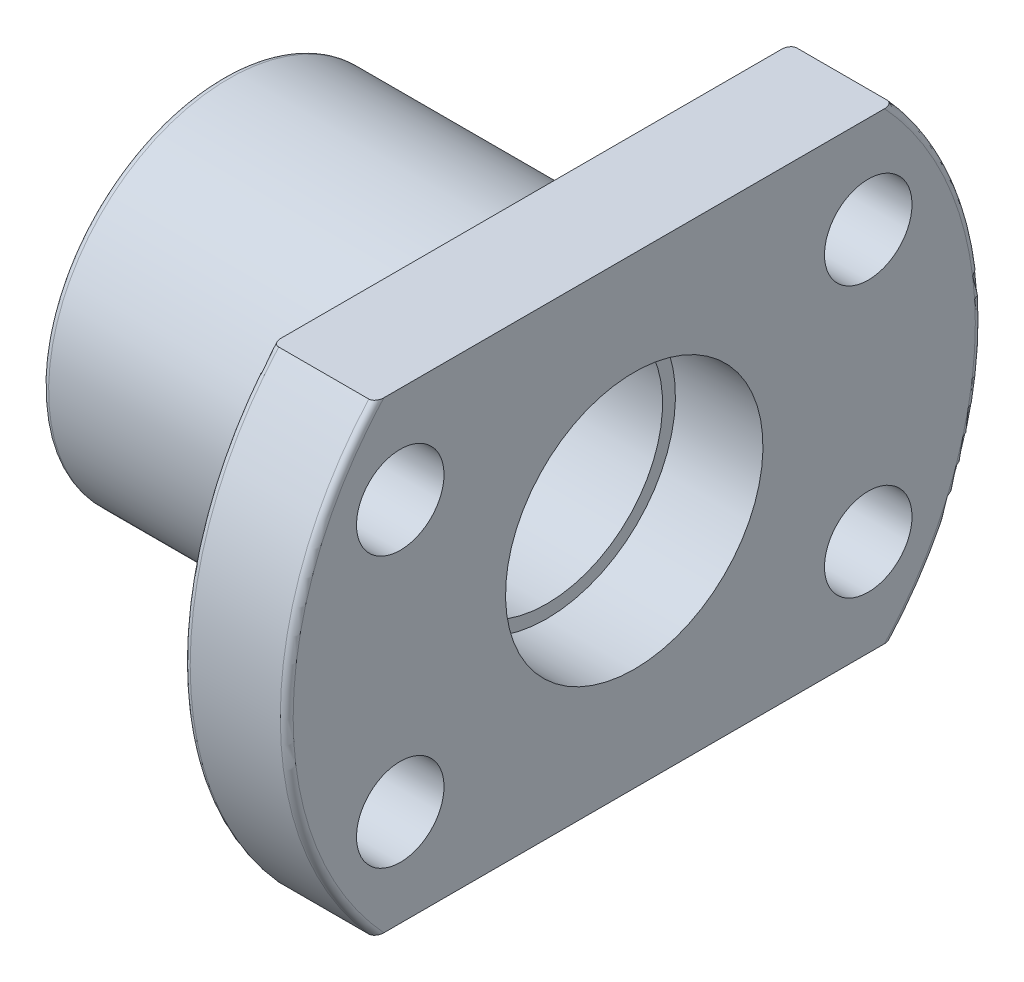
ISO-10303-21;
HEADER;
FILE_DESCRIPTION(('STEP AP214'),'2;1');
FILE_NAME('part.step','',(''),(''),'','','');
FILE_SCHEMA(('AUTOMOTIVE_DESIGN { 1 0 10303 214 1 1 1 1 }'));
ENDSEC;
DATA;
#1=APPLICATION_CONTEXT('core data for automotive mechanical design processes');
#2=APPLICATION_PROTOCOL_DEFINITION('international standard','automotive_design',2000,#1);
#3=PRODUCT_CONTEXT('',#1,'mechanical');
#4=PRODUCT('Part','Part','',(#3));
#5=PRODUCT_RELATED_PRODUCT_CATEGORY('part','',(#4));
#6=PRODUCT_DEFINITION_FORMATION('','',#4);
#7=PRODUCT_DEFINITION_CONTEXT('part definition',#1,'design');
#8=PRODUCT_DEFINITION('design','',#6,#7);
#9=PRODUCT_DEFINITION_SHAPE('','',#8);
#10=(LENGTH_UNIT() NAMED_UNIT(*) SI_UNIT(.MILLI.,.METRE.));
#11=(NAMED_UNIT(*) PLANE_ANGLE_UNIT() SI_UNIT($,.RADIAN.));
#12=(NAMED_UNIT(*) SI_UNIT($,.STERADIAN.) SOLID_ANGLE_UNIT());
#13=UNCERTAINTY_MEASURE_WITH_UNIT(LENGTH_MEASURE(1.E-05),#10,'distance_accuracy_value','');
#14=(GEOMETRIC_REPRESENTATION_CONTEXT(3) GLOBAL_UNCERTAINTY_ASSIGNED_CONTEXT((#13)) GLOBAL_UNIT_ASSIGNED_CONTEXT((#10,
#11,#12)) REPRESENTATION_CONTEXT('',''));
#15=CARTESIAN_POINT('',(0.,0.,0.));
#16=DIRECTION('',(0.,0.,1.));
#17=DIRECTION('',(1.,0.,0.));
#18=AXIS2_PLACEMENT_3D('',#15,#16,#17);
#19=CARTESIAN_POINT('',(-11.4,4.75,0.));
#20=DIRECTION('',(1.,0.,0.));
#21=DIRECTION('',(0.,-1.,0.));
#22=AXIS2_PLACEMENT_3D('',#19,#20,#21);
#23=PLANE('',#22);
#24=CARTESIAN_POINT('',(-11.4,0.,0.));
#25=DIRECTION('',(-1.,0.,0.));
#26=DIRECTION('',(0.,-1.,0.));
#27=AXIS2_PLACEMENT_3D('',#24,#25,#26);
#28=CIRCLE('',#27,4.5);
#29=CARTESIAN_POINT('',(-11.4,-4.49999999999998,0.));
#30=VERTEX_POINT('',#29);
#31=EDGE_CURVE('E140',#30,#30,#28,.T.);
#32=ORIENTED_EDGE('',*,*,#31,.T.);
#33=EDGE_LOOP('',(#32));
#34=FACE_BOUND('',#33,.T.);
#35=CARTESIAN_POINT('',(-11.4,0.,0.));
#36=DIRECTION('',(1.,0.,0.));
#37=DIRECTION('',(0.,-1.,0.));
#38=AXIS2_PLACEMENT_3D('',#35,#36,#37);
#39=CIRCLE('',#38,5.);
#40=CARTESIAN_POINT('',(-11.4,-4.99999999999999,0.));
#41=VERTEX_POINT('',#40);
#42=EDGE_CURVE('E500',#41,#41,#39,.T.);
#43=ORIENTED_EDGE('',*,*,#42,.T.);
#44=EDGE_LOOP('',(#43));
#45=FACE_BOUND('',#44,.T.);
#46=ADVANCED_FACE('F16',(#34,#45),#23,.T.);
#47=CARTESIAN_POINT('',(-8.25000000000013,0.,0.));
#48=DIRECTION('',(-1.,0.,0.));
#49=DIRECTION('',(0.,0.,1.));
#50=AXIS2_PLACEMENT_3D('',#47,#48,#49);
#51=TOROIDAL_SURFACE('',#50,13.2499999999999,0.250000000000088);
#52=CARTESIAN_POINT('',(-8.24999999999987,0.,0.));
#53=DIRECTION('',(-1.,0.,0.));
#54=DIRECTION('',(0.,-1.,0.));
#55=AXIS2_PLACEMENT_3D('',#52,#53,#54);
#56=CIRCLE('',#55,13.5);
#57=CARTESIAN_POINT('',(-8.24999999999989,-9.,10.0623058987491));
#58=VERTEX_POINT('',#57);
#59=CARTESIAN_POINT('',(-8.24999999999987,9.,10.062305898749));
#60=VERTEX_POINT('',#59);
#61=EDGE_CURVE('E32',#58,#60,#56,.T.);
#62=ORIENTED_EDGE('',*,*,#61,.F.);
#63=CARTESIAN_POINT('',(-8.2499999999999,-9.,10.0623058987491));
#64=CARTESIAN_POINT('',(-8.23844278327261,-9.,10.0623305286698));
#65=CARTESIAN_POINT('',(-8.22690988890774,-9.,10.0612324497511));
#66=CARTESIAN_POINT('',(-8.20430947649132,-9.,10.0570016457878));
#67=CARTESIAN_POINT('',(-8.19323911111858,-9.,10.0538842825436));
#68=CARTESIAN_POINT('',(-8.17182028569948,-9.,10.0458289475761));
#69=CARTESIAN_POINT('',(-8.16147029647205,-9.,10.0408949814857));
#70=CARTESIAN_POINT('',(-8.14164352792368,-9.,10.0294873692714));
#71=CARTESIAN_POINT('',(-8.13216848373303,-9.,10.0230107511588));
#72=CARTESIAN_POINT('',(-8.11103822136083,-9.,10.0062905797401));
#73=CARTESIAN_POINT('',(-8.09979628754916,-9.,9.99552473917527));
#74=CARTESIAN_POINT('',(-8.07920696399965,-9.,9.97231886982991));
#75=CARTESIAN_POINT('',(-8.06986259525865,-9.,9.95987622308781));
#76=CARTESIAN_POINT('',(-8.05027827977875,-9.,9.92953927962129));
#77=CARTESIAN_POINT('',(-8.04074231960901,-9.,9.9111915678981));
#78=CARTESIAN_POINT('',(-8.02473799104098,-9.,9.87319319136513));
#79=CARTESIAN_POINT('',(-8.01827589421854,-9.,9.85353995516554));
#80=CARTESIAN_POINT('',(-8.00878551200624,-9.,9.81564095750287));
#81=CARTESIAN_POINT('',(-8.00546624569823,-9.,9.79746630050199));
#82=CARTESIAN_POINT('',(-8.00108490760523,-9.,9.76096458610604));
#83=CARTESIAN_POINT('',(-8.0000083090631,-9.,9.74263928635581));
#84=CARTESIAN_POINT('',(-8.00000000000002,-9.,9.72432516938832));
#85=B_SPLINE_CURVE_WITH_KNOTS('',3,(#63,#64,#65,#66,#67,#68,#69,#70,#71,#72,#73,#74,#75,#76,#77,
#78,#79,#80,#81,#82,#83,#84),.UNSPECIFIED.,.F.,.F.,(4,2,2,2,2,2,2,2,2,2,4),(0.,
0.0345810463784252,0.068902057371181,0.103147838940847,0.137460137931458,0.183901477980139,
0.230416184586436,0.292120283952455,0.353949743307429,0.409237105654695,0.464165219215512),.UNSPECIFIED.);
#86=CARTESIAN_POINT('',(-8.00000000000001,-9.,9.72432516938832));
#87=VERTEX_POINT('',#86);
#88=EDGE_CURVE('E202',#58,#87,#85,.T.);
#89=ORIENTED_EDGE('',*,*,#88,.T.);
#90=CARTESIAN_POINT('',(-8.,-9.,9.72432516938832));
#91=CARTESIAN_POINT('',(-8.00000000000003,-3.64693951476596,14.6786580951081));
#92=CARTESIAN_POINT('',(-8.00000000000001,3.64693951476596,14.6786580951081));
#93=CARTESIAN_POINT('',(-8.,9.,9.72432516938835));
#94=(BOUNDED_CURVE() B_SPLINE_CURVE(3,(#90,#91,#92,#93),.UNSPECIFIED.,.F.,
.F.) B_SPLINE_CURVE_WITH_KNOTS((4,4),(0.,1.),
.UNSPECIFIED.) CURVE() GEOMETRIC_REPRESENTATION_ITEM() RATIONAL_B_SPLINE_CURVE((1.,
0.822607555692496,0.822607555692496,1.)) REPRESENTATION_ITEM(''));
#95=CARTESIAN_POINT('',(-8.,9.,9.72432516938835));
#96=VERTEX_POINT('',#95);
#97=EDGE_CURVE('E167',#87,#96,#94,.T.);
#98=ORIENTED_EDGE('',*,*,#97,.T.);
#99=CARTESIAN_POINT('',(-7.99999999999989,9.,9.72432516938835));
#100=CARTESIAN_POINT('',(-8.00001321221725,9.,9.74533665736818));
#101=CARTESIAN_POINT('',(-8.00142891869278,9.,9.76637804172869));
#102=CARTESIAN_POINT('',(-8.00721340471613,9.,9.8082059964484));
#103=CARTESIAN_POINT('',(-8.01160404824915,9.,9.828989511796));
#104=CARTESIAN_POINT('',(-8.02306869979154,9.,9.86821841659496));
#105=CARTESIAN_POINT('',(-8.0299302867895,9.,9.88672508603577));
#106=CARTESIAN_POINT('',(-8.0464932099802,9.,9.92239736665175));
#107=CARTESIAN_POINT('',(-8.0561869915123,9.,9.93956639351648));
#108=CARTESIAN_POINT('',(-8.07579480928787,9.,9.96784017576048));
#109=CARTESIAN_POINT('',(-8.08506012168781,9.,9.97939393106422));
#110=CARTESIAN_POINT('',(-8.10531490363229,9.,10.0008906379686));
#111=CARTESIAN_POINT('',(-8.11630263002007,9.,10.0108351976871));
#112=CARTESIAN_POINT('',(-8.13766385162582,9.,10.0268704168902));
#113=CARTESIAN_POINT('',(-8.14775623782269,9.,10.0333343420794));
#114=CARTESIAN_POINT('',(-8.16886001583226,9.,10.0445055677807));
#115=CARTESIAN_POINT('',(-8.1798694471561,9.,10.0492165036338));
#116=CARTESIAN_POINT('',(-8.20066697762734,9.,10.0559678926762));
#117=CARTESIAN_POINT('',(-8.21035309727974,9.,10.0583224398357));
#118=CARTESIAN_POINT('',(-8.23002055983697,9.,10.061502109796));
#119=CARTESIAN_POINT('',(-8.24000312636209,9.,10.0623196073748));
#120=CARTESIAN_POINT('',(-8.24999999999988,9.,10.0623058987491));
#121=B_SPLINE_CURVE_WITH_KNOTS('',3,(#99,#100,#101,#102,#103,#104,#105,#106,#107,#108,#109,#110,
#111,#112,#113,#114,#115,#116,#117,#118,#119,#120),.UNSPECIFIED.,.F.,.F.,(4,2,2,2,2,2,2,2,2,2,
4),(0.,0.0630369857374406,0.126542353612292,0.185543278896026,0.244388238634463,
0.288664310009508,0.332895858003411,0.368709067601378,0.404447588462333,0.434233817368425,
0.464167428240694),.UNSPECIFIED.);
#122=EDGE_CURVE('E169',#96,#60,#121,.T.);
#123=ORIENTED_EDGE('',*,*,#122,.T.);
#124=EDGE_LOOP('',(#62,#89,#98,#123));
#125=FACE_BOUND('',#124,.T.);
#126=ADVANCED_FACE('F184',(#125),#51,.T.);
#127=CARTESIAN_POINT('',(-8.25000000000014,0.,0.));
#128=DIRECTION('',(-1.,0.,0.));
#129=DIRECTION('',(0.,0.,1.));
#130=AXIS2_PLACEMENT_3D('',#127,#128,#129);
#131=TOROIDAL_SURFACE('',#130,13.25,0.250000000000001);
#132=CARTESIAN_POINT('',(-8.,9.,-9.72432516938836));
#133=CARTESIAN_POINT('',(-8.00000000000002,3.64693951476629,-14.6786580951079));
#134=CARTESIAN_POINT('',(-8.00000000000003,-3.6469395147652,-14.6786580951081));
#135=CARTESIAN_POINT('',(-8.,-8.99999999999985,-9.72432516938961));
#136=(BOUNDED_CURVE() B_SPLINE_CURVE(3,(#132,#133,#134,#135),.UNSPECIFIED.,.F.,
.F.) B_SPLINE_CURVE_WITH_KNOTS((4,4),(0.,1.),
.UNSPECIFIED.) CURVE() GEOMETRIC_REPRESENTATION_ITEM() RATIONAL_B_SPLINE_CURVE((1.,
0.822607555692512,0.822607555692512,1.)) REPRESENTATION_ITEM(''));
#137=CARTESIAN_POINT('',(-8.,9.,-9.72432516938836));
#138=VERTEX_POINT('',#137);
#139=CARTESIAN_POINT('',(-8.,-8.99999999999993,-9.72432516938961));
#140=VERTEX_POINT('',#139);
#141=EDGE_CURVE('E47',#138,#140,#136,.T.);
#142=ORIENTED_EDGE('',*,*,#141,.T.);
#143=CARTESIAN_POINT('',(-8.00000000000013,-9.,-9.72432516938961));
#144=CARTESIAN_POINT('',(-8.00001321221754,-9.,-9.74533665736944));
#145=CARTESIAN_POINT('',(-8.00142891869313,-9.,-9.76637804172993));
#146=CARTESIAN_POINT('',(-8.00721340471658,-9.,-9.80820599644961));
#147=CARTESIAN_POINT('',(-8.01160404824966,-9.,-9.8289895117972));
#148=CARTESIAN_POINT('',(-8.02306869979214,-9.,-9.86821841659606));
#149=CARTESIAN_POINT('',(-8.02993028679014,-9.,-9.88672508603679));
#150=CARTESIAN_POINT('',(-8.04649320998088,-9.,-9.92239736665262));
#151=CARTESIAN_POINT('',(-8.056186991513,-9.,-9.93956639351727));
#152=CARTESIAN_POINT('',(-8.07579480928859,-9.,-9.96784017576114));
#153=CARTESIAN_POINT('',(-8.08506012168854,-9.,-9.97939393106483));
#154=CARTESIAN_POINT('',(-8.10531490363302,-9.,-10.0008906379691));
#155=CARTESIAN_POINT('',(-8.1163026300208,-9.,-10.0108351976876));
#156=CARTESIAN_POINT('',(-8.13766385162656,-9.,-10.0268704168905));
#157=CARTESIAN_POINT('',(-8.14775623782343,-9.,-10.0333343420797));
#158=CARTESIAN_POINT('',(-8.168860015833,-9.,-10.0445055677809));
#159=CARTESIAN_POINT('',(-8.17986944715682,-9.,-10.0492165036339));
#160=CARTESIAN_POINT('',(-8.20066697762795,-9.,-10.0559678926763));
#161=CARTESIAN_POINT('',(-8.21035309728024,-9.,-10.0583224398358));
#162=CARTESIAN_POINT('',(-8.23002055983724,-9.,-10.061502109796));
#163=CARTESIAN_POINT('',(-8.24000312636224,-9.,-10.0623196073748));
#164=CARTESIAN_POINT('',(-8.24999999999991,-9.,-10.0623058987491));
#165=B_SPLINE_CURVE_WITH_KNOTS('',3,(#143,#144,#145,#146,#147,#148,#149,#150,#151,#152,#153,
#154,#155,#156,#157,#158,#159,#160,#161,#162,#163,#164),.UNSPECIFIED.,.F.,.F.,(4,2,2,2,2,2,2,2,
2,2,4),(0.,0.0630369857374203,0.126542353612252,0.185543278895805,0.244388238634066,
0.288664310009,0.332895858002792,0.368709067600696,0.404447588461579,0.434233817367323,
0.464167428239235),.UNSPECIFIED.);
#166=CARTESIAN_POINT('',(-8.2499999999999,-9.,-10.0623058987503));
#167=VERTEX_POINT('',#166);
#168=EDGE_CURVE('E192',#140,#167,#165,.T.);
#169=ORIENTED_EDGE('',*,*,#168,.T.);
#170=CARTESIAN_POINT('',(-8.24999999999989,0.,0.));
#171=DIRECTION('',(-1.,0.,0.));
#172=DIRECTION('',(0.,-1.,0.));
#173=AXIS2_PLACEMENT_3D('',#170,#171,#172);
#174=CIRCLE('',#173,13.5);
#175=CARTESIAN_POINT('',(-8.24999999999989,9.,-10.0623058987491));
#176=VERTEX_POINT('',#175);
#177=EDGE_CURVE('E11',#176,#167,#174,.T.);
#178=ORIENTED_EDGE('',*,*,#177,.F.);
#179=CARTESIAN_POINT('',(-8.2499999999999,9.,-10.0623058987491));
#180=CARTESIAN_POINT('',(-8.23844278327262,9.,-10.0623305286698));
#181=CARTESIAN_POINT('',(-8.22690988890775,9.,-10.0612324497511));
#182=CARTESIAN_POINT('',(-8.20430947649135,9.,-10.0570016457878));
#183=CARTESIAN_POINT('',(-8.19323911111861,9.,-10.0538842825437));
#184=CARTESIAN_POINT('',(-8.17182028569951,9.,-10.0458289475761));
#185=CARTESIAN_POINT('',(-8.16147029647209,9.,-10.0408949814858));
#186=CARTESIAN_POINT('',(-8.14164352792372,9.,-10.0294873692715));
#187=CARTESIAN_POINT('',(-8.13216848373307,9.,-10.0230107511589));
#188=CARTESIAN_POINT('',(-8.11103822136087,9.,-10.0062905797402));
#189=CARTESIAN_POINT('',(-8.09979628754921,9.,-9.99552473917538));
#190=CARTESIAN_POINT('',(-8.0792069639997,9.,-9.97231886983005));
#191=CARTESIAN_POINT('',(-8.0698625952587,9.,-9.95987622308797));
#192=CARTESIAN_POINT('',(-8.0502782797788,9.,-9.92953927962148));
#193=CARTESIAN_POINT('',(-8.04074231960906,9.,-9.91119156789831));
#194=CARTESIAN_POINT('',(-8.02473799104102,9.,-9.87319319136538));
#195=CARTESIAN_POINT('',(-8.01827589421858,9.,-9.85353995516581));
#196=CARTESIAN_POINT('',(-8.00878551200625,9.,-9.81564095750312));
#197=CARTESIAN_POINT('',(-8.00546624569823,9.,-9.7974663005022));
#198=CARTESIAN_POINT('',(-8.00108490760521,9.,-9.76096458610616));
#199=CARTESIAN_POINT('',(-8.00000830906307,9.,-9.74263928635588));
#200=CARTESIAN_POINT('',(-8.,9.,-9.72432516938836));
#201=B_SPLINE_CURVE_WITH_KNOTS('',3,(#179,#180,#181,#182,#183,#184,#185,#186,#187,#188,#189,
#190,#191,#192,#193,#194,#195,#196,#197,#198,#199,#200),.UNSPECIFIED.,.F.,.F.,(4,2,2,2,2,2,2,2,
2,2,4),(0.,0.0345810463784045,0.0689020573711454,0.103147838940792,0.137460137931387,
0.183901477980033,0.230416184586295,0.292120283952265,0.353949743307192,0.409237105654585,
0.464165219215521),.UNSPECIFIED.);
#202=EDGE_CURVE('E158',#176,#138,#201,.T.);
#203=ORIENTED_EDGE('',*,*,#202,.T.);
#204=EDGE_LOOP('',(#142,#169,#178,#203));
#205=FACE_BOUND('',#204,.T.);
#206=ADVANCED_FACE('F179',(#205),#131,.T.);
#207=CARTESIAN_POINT('',(-20.6,4.75,0.));
#208=DIRECTION('',(1.,0.,0.));
#209=DIRECTION('',(0.,-1.,0.));
#210=AXIS2_PLACEMENT_3D('',#207,#208,#209);
#211=PLANE('',#210);
#212=CARTESIAN_POINT('',(-20.6,0.,0.));
#213=DIRECTION('',(-1.,0.,0.));
#214=DIRECTION('',(0.,-1.,0.));
#215=AXIS2_PLACEMENT_3D('',#212,#213,#214);
#216=CIRCLE('',#215,4.5);
#217=CARTESIAN_POINT('',(-20.6,-4.49999999999997,0.));
#218=VERTEX_POINT('',#217);
#219=EDGE_CURVE('E133',#218,#218,#216,.T.);
#220=ORIENTED_EDGE('',*,*,#219,.F.);
#221=EDGE_LOOP('',(#220));
#222=FACE_BOUND('',#221,.T.);
#223=CARTESIAN_POINT('',(-20.6,0.,0.));
#224=DIRECTION('',(-1.,0.,0.));
#225=DIRECTION('',(0.,-1.,0.));
#226=AXIS2_PLACEMENT_3D('',#223,#224,#225);
#227=CIRCLE('',#226,5.);
#228=CARTESIAN_POINT('',(-20.6,-4.99999999999997,0.));
#229=VERTEX_POINT('',#228);
#230=EDGE_CURVE('E522',#229,#229,#227,.T.);
#231=ORIENTED_EDGE('',*,*,#230,.T.);
#232=EDGE_LOOP('',(#231));
#233=FACE_BOUND('',#232,.T.);
#234=ADVANCED_FACE('F183',(#222,#233),#211,.F.);
#235=CARTESIAN_POINT('',(0.,0.,0.));
#236=DIRECTION('',(-1.,0.,0.));
#237=DIRECTION('',(0.,-1.,0.));
#238=AXIS2_PLACEMENT_3D('',#235,#236,#237);
#239=CYLINDRICAL_SURFACE('',#238,13.5);
#240=DIRECTION('',(1.,0.,0.));
#241=VECTOR('',#240,1.);
#242=CARTESIAN_POINT('',(-8.,-9.,-10.0623058987515));
#243=LINE('',#242,#241);
#244=CARTESIAN_POINT('',(-11.7500000000001,-9.,-10.0623058987503));
#245=VERTEX_POINT('',#244);
#246=EDGE_CURVE('E144',#245,#167,#243,.T.);
#247=ORIENTED_EDGE('',*,*,#246,.F.);
#248=CARTESIAN_POINT('',(-11.75,0.,0.));
#249=DIRECTION('',(-1.,0.,0.));
#250=DIRECTION('',(0.,-1.,0.));
#251=AXIS2_PLACEMENT_3D('',#248,#249,#250);
#252=CIRCLE('',#251,13.5);
#253=CARTESIAN_POINT('',(-11.75,9.,-10.0623058987491));
#254=VERTEX_POINT('',#253);
#255=EDGE_CURVE('E341',#254,#245,#252,.T.);
#256=ORIENTED_EDGE('',*,*,#255,.F.);
#257=DIRECTION('',(1.,0.,0.));
#258=VECTOR('',#257,1.);
#259=CARTESIAN_POINT('',(-8.,9.,-10.0623058987491));
#260=LINE('',#259,#258);
#261=EDGE_CURVE('E321',#254,#176,#260,.T.);
#262=ORIENTED_EDGE('',*,*,#261,.T.);
#263=ORIENTED_EDGE('',*,*,#177,.T.);
#264=EDGE_LOOP('',(#247,#256,#262,#263));
#265=FACE_BOUND('',#264,.T.);
#266=ADVANCED_FACE('F274',(#265),#239,.T.);
#267=CARTESIAN_POINT('',(0.,0.,0.));
#268=DIRECTION('',(-1.,0.,0.));
#269=DIRECTION('',(0.,-1.,0.));
#270=AXIS2_PLACEMENT_3D('',#267,#268,#269);
#271=CYLINDRICAL_SURFACE('',#270,13.5);
#272=DIRECTION('',(-1.,0.,0.));
#273=VECTOR('',#272,1.);
#274=CARTESIAN_POINT('',(-8.,-9.,10.0623058987491));
#275=LINE('',#274,#273);
#276=CARTESIAN_POINT('',(-11.7500000000007,-9.,10.0623058987491));
#277=VERTEX_POINT('',#276);
#278=EDGE_CURVE('E111',#58,#277,#275,.T.);
#279=ORIENTED_EDGE('',*,*,#278,.F.);
#280=ORIENTED_EDGE('',*,*,#61,.T.);
#281=DIRECTION('',(-1.,0.,0.));
#282=VECTOR('',#281,1.);
#283=CARTESIAN_POINT('',(-8.,9.,10.062305898749));
#284=LINE('',#283,#282);
#285=CARTESIAN_POINT('',(-11.75,9.,10.062305898749));
#286=VERTEX_POINT('',#285);
#287=EDGE_CURVE('E316',#60,#286,#284,.T.);
#288=ORIENTED_EDGE('',*,*,#287,.T.);
#289=CARTESIAN_POINT('',(-11.75,0.,0.));
#290=DIRECTION('',(-1.,0.,0.));
#291=DIRECTION('',(0.,-1.,0.));
#292=AXIS2_PLACEMENT_3D('',#289,#290,#291);
#293=CIRCLE('',#292,13.5);
#294=EDGE_CURVE('E116',#277,#286,#293,.T.);
#295=ORIENTED_EDGE('',*,*,#294,.F.);
#296=EDGE_LOOP('',(#279,#280,#288,#295));
#297=FACE_BOUND('',#296,.T.);
#298=ADVANCED_FACE('F278',(#297),#271,.T.);
#299=CARTESIAN_POINT('',(-8.,9.125,0.));
#300=DIRECTION('',(-1.,0.,0.));
#301=DIRECTION('',(0.,0.,1.));
#302=AXIS2_PLACEMENT_3D('',#299,#300,#301);
#303=PLANE('',#302);
#304=CARTESIAN_POINT('',(-8.,0.,0.));
#305=DIRECTION('',(1.,0.,0.));
#306=DIRECTION('',(0.,-1.,0.));
#307=AXIS2_PLACEMENT_3D('',#304,#305,#306);
#308=CIRCLE('',#307,5.);
#309=CARTESIAN_POINT('',(-8.00000000000001,-4.99999999999999,0.));
#310=VERTEX_POINT('',#309);
#311=EDGE_CURVE('E292',#310,#310,#308,.T.);
#312=ORIENTED_EDGE('',*,*,#311,.F.);
#313=EDGE_LOOP('',(#312));
#314=FACE_BOUND('',#313,.T.);
#315=CARTESIAN_POINT('',(-8.,5.25,9.09));
#316=DIRECTION('',(-1.,0.,0.));
#317=DIRECTION('',(0.,-1.,0.));
#318=AXIS2_PLACEMENT_3D('',#315,#316,#317);
#319=CIRCLE('',#318,1.7);
#320=CARTESIAN_POINT('',(-8.,3.55,9.09));
#321=VERTEX_POINT('',#320);
#322=EDGE_CURVE('E296',#321,#321,#319,.T.);
#323=ORIENTED_EDGE('',*,*,#322,.T.);
#324=EDGE_LOOP('',(#323));
#325=FACE_BOUND('',#324,.T.);
#326=CARTESIAN_POINT('',(-8.,-5.25,9.09));
#327=DIRECTION('',(-1.,0.,0.));
#328=DIRECTION('',(0.,-1.,0.));
#329=AXIS2_PLACEMENT_3D('',#326,#327,#328);
#330=CIRCLE('',#329,1.7);
#331=CARTESIAN_POINT('',(-8.,-6.95,9.09));
#332=VERTEX_POINT('',#331);
#333=EDGE_CURVE('E300',#332,#332,#330,.T.);
#334=ORIENTED_EDGE('',*,*,#333,.T.);
#335=EDGE_LOOP('',(#334));
#336=FACE_BOUND('',#335,.T.);
#337=CARTESIAN_POINT('',(-8.,-5.25,-9.09));
#338=DIRECTION('',(-1.,0.,0.));
#339=DIRECTION('',(0.,-1.,0.));
#340=AXIS2_PLACEMENT_3D('',#337,#338,#339);
#341=CIRCLE('',#340,1.7);
#342=CARTESIAN_POINT('',(-8.,-6.95,-9.09));
#343=VERTEX_POINT('',#342);
#344=EDGE_CURVE('E304',#343,#343,#341,.T.);
#345=ORIENTED_EDGE('',*,*,#344,.T.);
#346=EDGE_LOOP('',(#345));
#347=FACE_BOUND('',#346,.T.);
#348=CARTESIAN_POINT('',(-8.,5.25,-9.09));
#349=DIRECTION('',(-1.,0.,0.));
#350=DIRECTION('',(0.,-1.,0.));
#351=AXIS2_PLACEMENT_3D('',#348,#349,#350);
#352=CIRCLE('',#351,1.7);
#353=CARTESIAN_POINT('',(-8.,3.55,-9.09));
#354=VERTEX_POINT('',#353);
#355=EDGE_CURVE('E307',#354,#354,#352,.T.);
#356=ORIENTED_EDGE('',*,*,#355,.T.);
#357=EDGE_LOOP('',(#356));
#358=FACE_BOUND('',#357,.T.);
#359=DIRECTION('',(0.,0.,1.));
#360=VECTOR('',#359,1.);
#361=CARTESIAN_POINT('',(-8.,9.,-17.438205463781));
#362=LINE('',#361,#360);
#363=EDGE_CURVE('E168',#138,#96,#362,.T.);
#364=ORIENTED_EDGE('',*,*,#363,.T.);
#365=ORIENTED_EDGE('',*,*,#97,.F.);
#366=DIRECTION('',(0.,0.,1.));
#367=VECTOR('',#366,1.);
#368=CARTESIAN_POINT('',(-8.,-9.,-17.438205463781));
#369=LINE('',#368,#367);
#370=EDGE_CURVE('E201',#140,#87,#369,.T.);
#371=ORIENTED_EDGE('',*,*,#370,.F.);
#372=ORIENTED_EDGE('',*,*,#141,.F.);
#373=EDGE_LOOP('',(#364,#365,#371,#372));
#374=FACE_BOUND('',#373,.T.);
#375=ADVANCED_FACE('F281',(#314,#325,#336,#347,#358,#374),#303,.F.);
#376=CARTESIAN_POINT('',(-8.,9.,-17.438205463781));
#377=DIRECTION('',(0.,-1.,0.));
#378=DIRECTION('',(0.,0.,-1.));
#379=AXIS2_PLACEMENT_3D('',#376,#377,#378);
#380=PLANE('',#379);
#381=ORIENTED_EDGE('',*,*,#261,.F.);
#382=CARTESIAN_POINT('',(-12.,9.,-9.72432516938836));
#383=CARTESIAN_POINT('',(-11.9999867877827,9.,-9.74533665736819));
#384=CARTESIAN_POINT('',(-11.9985710813071,9.,-9.76637804172869));
#385=CARTESIAN_POINT('',(-11.9927865952838,9.,-9.80820599644839));
#386=CARTESIAN_POINT('',(-11.9883959517508,9.,-9.82898951179599));
#387=CARTESIAN_POINT('',(-11.9769313002084,9.,-9.86821841659493));
#388=CARTESIAN_POINT('',(-11.9700697132104,9.,-9.88672508603574));
#389=CARTESIAN_POINT('',(-11.9535067900197,9.,-9.92239736665172));
#390=CARTESIAN_POINT('',(-11.9438130084876,9.,-9.93956639351645));
#391=CARTESIAN_POINT('',(-11.9242051907121,9.,-9.96784017576044));
#392=CARTESIAN_POINT('',(-11.9149398783121,9.,-9.97939393106418));
#393=CARTESIAN_POINT('',(-11.8946850963677,9.,-10.0008906379686));
#394=CARTESIAN_POINT('',(-11.8836973699799,9.,-10.0108351976871));
#395=CARTESIAN_POINT('',(-11.8623361483741,9.,-10.0268704168901));
#396=CARTESIAN_POINT('',(-11.8522437621773,9.,-10.0333343420794));
#397=CARTESIAN_POINT('',(-11.8311399841677,9.,-10.0445055677806));
#398=CARTESIAN_POINT('',(-11.8201305528439,9.,-10.0492165036337));
#399=CARTESIAN_POINT('',(-11.7993330223726,9.,-10.0559678926762));
#400=CARTESIAN_POINT('',(-11.7896469027202,9.,-10.0583224398357));
#401=CARTESIAN_POINT('',(-11.7699794401629,9.,-10.061502109796));
#402=CARTESIAN_POINT('',(-11.7599968736378,9.,-10.0623196073748));
#403=CARTESIAN_POINT('',(-11.75,9.,-10.0623058987491));
#404=B_SPLINE_CURVE_WITH_KNOTS('',3,(#382,#383,#384,#385,#386,#387,#388,#389,#390,#391,#392,
#393,#394,#395,#396,#397,#398,#399,#400,#401,#402,#403),.UNSPECIFIED.,.F.,.F.,(4,2,2,2,2,2,2,2,
2,2,4),(0.,0.0630369857374245,0.126542353612255,0.185543278895978,0.244388238634407,
0.288664310009441,0.332895858003332,0.36870906760129,0.404447588462235,0.434233817368381,
0.464167428240702),.UNSPECIFIED.);
#405=CARTESIAN_POINT('',(-12.,9.,-9.72432516938836));
#406=VERTEX_POINT('',#405);
#407=EDGE_CURVE('E327',#406,#254,#404,.T.);
#408=ORIENTED_EDGE('',*,*,#407,.F.);
#409=DIRECTION('',(0.,0.,-1.));
#410=VECTOR('',#409,1.);
#411=CARTESIAN_POINT('',(-12.,9.,0.));
#412=LINE('',#411,#410);
#413=CARTESIAN_POINT('',(-12.,9.,9.72432516938836));
#414=VERTEX_POINT('',#413);
#415=EDGE_CURVE('E127',#414,#406,#412,.T.);
#416=ORIENTED_EDGE('',*,*,#415,.F.);
#417=CARTESIAN_POINT('',(-11.75,9.,10.0623058987491));
#418=CARTESIAN_POINT('',(-11.7615572167273,9.,10.0623305286699));
#419=CARTESIAN_POINT('',(-11.7730901110921,9.,10.0612324497511));
#420=CARTESIAN_POINT('',(-11.7956905235085,9.,10.0570016457879));
#421=CARTESIAN_POINT('',(-11.8067608888813,9.,10.0538842825437));
#422=CARTESIAN_POINT('',(-11.8281797143004,9.,10.0458289475762));
#423=CARTESIAN_POINT('',(-11.8385297035278,9.,10.0408949814858));
#424=CARTESIAN_POINT('',(-11.8583564720762,9.,10.0294873692716));
#425=CARTESIAN_POINT('',(-11.8678315162668,9.,10.023010751159));
#426=CARTESIAN_POINT('',(-11.888961778639,9.,10.0062905797403));
#427=CARTESIAN_POINT('',(-11.9002037124507,9.,9.99552473917551));
#428=CARTESIAN_POINT('',(-11.9207930360002,9.,9.9723188698302));
#429=CARTESIAN_POINT('',(-11.9301374047412,9.,9.95987622308813));
#430=CARTESIAN_POINT('',(-11.9497217202211,9.,9.92953927962167));
#431=CARTESIAN_POINT('',(-11.9592576803909,9.,9.91119156789851));
#432=CARTESIAN_POINT('',(-11.9752620089589,9.,9.8731931913656));
#433=CARTESIAN_POINT('',(-11.9817241057814,9.,9.85353995516605));
#434=CARTESIAN_POINT('',(-11.9912144879937,9.,9.81564095750333));
#435=CARTESIAN_POINT('',(-11.9945337543018,9.,9.79746630050237));
#436=CARTESIAN_POINT('',(-11.9989150923948,9.,9.76096458610624));
#437=CARTESIAN_POINT('',(-11.9999916909369,9.,9.74263928635593));
#438=CARTESIAN_POINT('',(-12.,9.,9.72432516938836));
#439=B_SPLINE_CURVE_WITH_KNOTS('',3,(#417,#418,#419,#420,#421,#422,#423,#424,#425,#426,#427,
#428,#429,#430,#431,#432,#433,#434,#435,#436,#437,#438),.UNSPECIFIED.,.F.,.F.,(4,2,2,2,2,2,2,2,
2,2,4),(0.,0.0345810463783977,0.0689020573711308,0.103147838940771,0.137460137931359,
0.183901477979982,0.23041618458622,0.292120283952162,0.353949743307062,0.409237105654584,
0.464165219215649),.UNSPECIFIED.);
#440=EDGE_CURVE('E122',#286,#414,#439,.T.);
#441=ORIENTED_EDGE('',*,*,#440,.F.);
#442=ORIENTED_EDGE('',*,*,#287,.F.);
#443=ORIENTED_EDGE('',*,*,#122,.F.);
#444=ORIENTED_EDGE('',*,*,#363,.F.);
#445=ORIENTED_EDGE('',*,*,#202,.F.);
#446=EDGE_LOOP('',(#381,#408,#416,#441,#442,#443,#444,#445));
#447=FACE_BOUND('',#446,.T.);
#448=ADVANCED_FACE('F176',(#447),#380,.F.);
#449=CARTESIAN_POINT('',(-11.75,0.,0.));
#450=DIRECTION('',(-1.,0.,0.));
#451=DIRECTION('',(0.,-1.,0.));
#452=AXIS2_PLACEMENT_3D('',#449,#450,#451);
#453=TOROIDAL_SURFACE('',#452,13.25,0.250000000000015);
#454=ORIENTED_EDGE('',*,*,#255,.T.);
#455=CARTESIAN_POINT('',(-12.,-9.,-9.72432516938835));
#456=CARTESIAN_POINT('',(-11.9999867877826,-9.,-9.74533665736818));
#457=CARTESIAN_POINT('',(-11.9985710813071,-9.,-9.76637804172868));
#458=CARTESIAN_POINT('',(-11.9927865952838,-9.,-9.80820599644838));
#459=CARTESIAN_POINT('',(-11.9883959517507,-9.,-9.82898951179598));
#460=CARTESIAN_POINT('',(-11.9769313002084,-9.,-9.86821841659492));
#461=CARTESIAN_POINT('',(-11.9700697132104,-9.,-9.88672508603572));
#462=CARTESIAN_POINT('',(-11.9535067900197,-9.,-9.9223973666517));
#463=CARTESIAN_POINT('',(-11.9438130084876,-9.,-9.93956639351643));
#464=CARTESIAN_POINT('',(-11.924205190712,-9.,-9.96784017576041));
#465=CARTESIAN_POINT('',(-11.9149398783121,-9.,-9.97939393106415));
#466=CARTESIAN_POINT('',(-11.8946850963676,-9.,-10.0008906379685));
#467=CARTESIAN_POINT('',(-11.8836973699799,-9.,-10.010835197687));
#468=CARTESIAN_POINT('',(-11.8623361483741,-9.,-10.0268704168901));
#469=CARTESIAN_POINT('',(-11.8522437621772,-9.,-10.0333343420793));
#470=CARTESIAN_POINT('',(-11.8311399841677,-9.,-10.0445055677806));
#471=CARTESIAN_POINT('',(-11.8201305528438,-9.,-10.0492165036337));
#472=CARTESIAN_POINT('',(-11.7993330223726,-9.,-10.0559678926761));
#473=CARTESIAN_POINT('',(-11.7896469027203,-9.,-10.0583224398356));
#474=CARTESIAN_POINT('',(-11.7699794401631,-9.,-10.0615021097959));
#475=CARTESIAN_POINT('',(-11.759996873638,-9.,-10.0623196073747));
#476=CARTESIAN_POINT('',(-11.7500000000003,-9.,-10.062305898749));
#477=B_SPLINE_CURVE_WITH_KNOTS('',3,(#455,#456,#457,#458,#459,#460,#461,#462,#463,#464,#465,
#466,#467,#468,#469,#470,#471,#472,#473,#474,#475,#476),.UNSPECIFIED.,.F.,.F.,(4,2,2,2,2,2,2,2,
2,2,4),(0.,0.0630369857374249,0.126542353612256,0.185543278895973,0.244388238634398,
0.288664310009431,0.332895858003323,0.36870906760128,0.404447588462222,0.434233817368218,
0.464167428240388),.UNSPECIFIED.);
#478=CARTESIAN_POINT('',(-12.,-9.,-9.72432516938835));
#479=VERTEX_POINT('',#478);
#480=EDGE_CURVE('E207',#479,#245,#477,.T.);
#481=ORIENTED_EDGE('',*,*,#480,.F.);
#482=CARTESIAN_POINT('',(-12.,9.,-9.72432516938836));
#483=CARTESIAN_POINT('',(-12.,8.71537674315208,-9.98774800511327));
#484=CARTESIAN_POINT('',(-12.,8.27280670752287,-10.3628042408422));
#485=CARTESIAN_POINT('',(-12.,7.72911348616349,-10.7652333179405));
#486=CARTESIAN_POINT('',(-12.,7.45042649720248,-10.9576637236767));
#487=CARTESIAN_POINT('',(-12.,7.30937290815165,-11.0516828933414));
#488=CARTESIAN_POINT('',(-12.,7.24855492115051,-11.0915062446542));
#489=CARTESIAN_POINT('',(-12.,7.2079281634083,-11.1179505725197));
#490=CARTESIAN_POINT('',(-12.,7.18867015631752,-11.1304154648659));
#491=CARTESIAN_POINT('',(-12.,6.82332485183639,-11.3653992569483));
#492=CARTESIAN_POINT('',(-12.,6.29438615702141,-11.6721006244972));
#493=CARTESIAN_POINT('',(-12.,5.6542661082154,-11.9860980876447));
#494=CARTESIAN_POINT('',(-12.,5.3284498575986,-12.1321416194703));
#495=CARTESIAN_POINT('',(-12.,5.18758084457415,-12.1923841617352));
#496=CARTESIAN_POINT('',(-12.,5.09339406321434,-12.2320241804));
#497=CARTESIAN_POINT('',(-12.,5.04790601664363,-12.2508734690792));
#498=CARTESIAN_POINT('',(-12.,4.60591697240431,-12.4309474105398));
#499=CARTESIAN_POINT('',(-12.,4.00773716836381,-12.6419169989961));
#500=CARTESIAN_POINT('',(-12.,3.29435384313741,-12.8370724352522));
#501=CARTESIAN_POINT('',(-12.,2.98529522793056,-12.9097871043028));
#502=CARTESIAN_POINT('',(-12.,2.77851772792699,-12.9558361336567));
#503=CARTESIAN_POINT('',(-12.,2.67667283473301,-12.9772685214095));
#504=CARTESIAN_POINT('',(-12.,1.72231066026007,-13.1660481706415));
#505=CARTESIAN_POINT('',(-12.,0.864759146221604,-13.2499668504809));
#506=CARTESIAN_POINT('',(-12.,-0.432379573110791,-13.2500165747595));
#507=CARTESIAN_POINT('',(-12.,-1.0779933270845,-13.218559510578));
#508=CARTESIAN_POINT('',(-12.,-1.82603706342531,-13.1267662313049));
#509=CARTESIAN_POINT('',(-12.,-2.14551888400811,-13.0756205321032));
#510=CARTESIAN_POINT('',(-12.,-2.35826046392228,-13.0388999054421));
#511=CARTESIAN_POINT('',(-12.,-2.4665883260898,-13.0188165264843));
#512=CARTESIAN_POINT('',(-12.,-2.98680966126521,-12.915954084017));
#513=CARTESIAN_POINT('',(-12.,-3.60246290358476,-12.7633163243874));
#514=CARTESIAN_POINT('',(-12.,-4.30565338981504,-12.5341339879824));
#515=CARTESIAN_POINT('',(-12.,-4.65348072547791,-12.4067665822373));
#516=CARTESIAN_POINT('',(-12.,-4.80174217487935,-12.3494427860159));
#517=CARTESIAN_POINT('',(-12.,-4.90040371698259,-12.3106185296044));
#518=CARTESIAN_POINT('',(-12.,-4.95146706958845,-12.2901599414355));
#519=CARTESIAN_POINT('',(-12.,-5.37742854884553,-12.1166556316893));
#520=CARTESIAN_POINT('',(-12.,-5.93245076000209,-11.8601556363678));
#521=CARTESIAN_POINT('',(-12.,-6.55735542427552,-11.5168740394209));
#522=CARTESIAN_POINT('',(-12.,-6.86415244422659,-11.3342253403462));
#523=CARTESIAN_POINT('',(-12.,-7.01613712615571,-11.2401490156586));
#524=CARTESIAN_POINT('',(-12.,-7.08097045525825,-11.1992408818317));
#525=CARTESIAN_POINT('',(-12.,-7.12412534951487,-11.171837746178));
#526=CARTESIAN_POINT('',(-12.,-7.14679224853309,-11.1573484086884));
#527=CARTESIAN_POINT('',(-12.,-7.8195634967197,-10.7247062707052));
#528=CARTESIAN_POINT('',(-12.,-8.43050374470173,-10.2514019802111));
#529=CARTESIAN_POINT('',(-12.,-9.,-9.72432516938835));
#530=(BOUNDED_CURVE() B_SPLINE_CURVE(3,(#482,#483,#484,#485,#486,#487,#488,#489,#490,#491,#492,
#493,#494,#495,#496,#497,#498,#499,#500,#501,#502,#503,#504,#505,#506,#507,#508,#509,#510,#511,
#512,#513,#514,#515,#516,#517,#518,#519,#520,#521,#522,#523,#524,#525,#526,#527,#528,#529),
.UNSPECIFIED.,.F.,.F.) B_SPLINE_CURVE_WITH_KNOTS((4,1,1,1,1,2,2,1,1,1,2,2,1,1,2,2,2,1,1,2,2,1,1,
1,2,2,1,1,1,1,2,2,4),(0.,0.0625000000000011,0.0937500000000016,0.109375000000002,
0.117187500000002,0.121093750000002,0.125000000000002,0.187500000000003,0.218750000000003,
0.234375000000004,0.242187500000004,0.250000000000004,0.312500000000004,0.343750000000004,
0.359375000000004,0.375000000000004,0.5,0.5625,0.59375,0.609375,0.625,0.6875,0.71875,0.734375,
0.7421875,0.75,0.8125,0.84375,0.859375,0.8671875,0.871093750000005,0.875,1.),
.UNSPECIFIED.) CURVE() GEOMETRIC_REPRESENTATION_ITEM() RATIONAL_B_SPLINE_CURVE((1.,1.,1.,1.,1.,
1.,1.,1.,1.,1.,1.,1.,1.,1.,1.,1.,1.,1.,1.,1.,1.,1.,1.,1.,1.,1.,1.,1.,1.,1.,1.,1.,1.,1.,1.,1.,1.,
1.,1.,1.,1.,1.,1.,1.,1.,1.,1.,1.)) REPRESENTATION_ITEM(''));
#531=EDGE_CURVE('E117',#406,#479,#530,.T.);
#532=ORIENTED_EDGE('',*,*,#531,.F.);
#533=ORIENTED_EDGE('',*,*,#407,.T.);
#534=EDGE_LOOP('',(#454,#481,#532,#533));
#535=FACE_BOUND('',#534,.T.);
#536=ADVANCED_FACE('F188',(#535),#453,.T.);
#537=CARTESIAN_POINT('',(-8.,-9.,-17.438205463781));
#538=DIRECTION('',(0.,-1.,0.));
#539=DIRECTION('',(0.,0.,-1.));
#540=AXIS2_PLACEMENT_3D('',#537,#538,#539);
#541=PLANE('',#540);
#542=DIRECTION('',(0.,0.,1.));
#543=VECTOR('',#542,1.);
#544=CARTESIAN_POINT('',(-12.,-9.,0.));
#545=LINE('',#544,#543);
#546=CARTESIAN_POINT('',(-12.,-9.,9.72432516938835));
#547=VERTEX_POINT('',#546);
#548=EDGE_CURVE('E108',#479,#547,#545,.T.);
#549=ORIENTED_EDGE('',*,*,#548,.F.);
#550=ORIENTED_EDGE('',*,*,#480,.T.);
#551=ORIENTED_EDGE('',*,*,#246,.T.);
#552=ORIENTED_EDGE('',*,*,#168,.F.);
#553=ORIENTED_EDGE('',*,*,#370,.T.);
#554=ORIENTED_EDGE('',*,*,#88,.F.);
#555=ORIENTED_EDGE('',*,*,#278,.T.);
#556=CARTESIAN_POINT('',(-12.,-9.,9.72432516938835));
#557=CARTESIAN_POINT('',(-11.9999867877826,-9.,9.74533665736818));
#558=CARTESIAN_POINT('',(-11.9985710813071,-9.,9.76637804172868));
#559=CARTESIAN_POINT('',(-11.9927865952838,-9.,9.80820599644837));
#560=CARTESIAN_POINT('',(-11.9883959517507,-9.,9.82898951179597));
#561=CARTESIAN_POINT('',(-11.9769313002084,-9.,9.86821841659492));
#562=CARTESIAN_POINT('',(-11.9700697132104,-9.,9.88672508603573));
#563=CARTESIAN_POINT('',(-11.9535067900197,-9.,9.92239736665171));
#564=CARTESIAN_POINT('',(-11.9438130084876,-9.,9.93956639351644));
#565=CARTESIAN_POINT('',(-11.9242051907121,-9.,9.96784017576043));
#566=CARTESIAN_POINT('',(-11.9149398783121,-9.,9.97939393106418));
#567=CARTESIAN_POINT('',(-11.8946850963677,-9.,10.0008906379686));
#568=CARTESIAN_POINT('',(-11.8836973699799,-9.,10.0108351976871));
#569=CARTESIAN_POINT('',(-11.8623361483741,-9.,10.0268704168901));
#570=CARTESIAN_POINT('',(-11.8522437621773,-9.,10.0333343420794));
#571=CARTESIAN_POINT('',(-11.8311399841677,-9.,10.0445055677806));
#572=CARTESIAN_POINT('',(-11.8201305528439,-9.,10.0492165036337));
#573=CARTESIAN_POINT('',(-11.7993330223728,-9.,10.0559678926761));
#574=CARTESIAN_POINT('',(-11.7896469027206,-9.,10.0583224398356));
#575=CARTESIAN_POINT('',(-11.7699794401638,-9.,10.0615021097959));
#576=CARTESIAN_POINT('',(-11.7599968736389,-9.,10.0623196073747));
#577=CARTESIAN_POINT('',(-11.7500000000013,-9.,10.0623058987491));
#578=B_SPLINE_CURVE_WITH_KNOTS('',3,(#556,#557,#558,#559,#560,#561,#562,#563,#564,#565,#566,
#567,#568,#569,#570,#571,#572,#573,#574,#575,#576,#577),.UNSPECIFIED.,.F.,.F.,(4,2,2,2,2,2,2,2,
2,2,4),(0.,0.0630369857374207,0.12654235361225,0.185543278895974,0.244388238634406,
0.288664310009442,0.332895858003335,0.368709067601294,0.404447588462236,0.434233817367743,
0.464167428239411),.UNSPECIFIED.);
#579=EDGE_CURVE('E20',#547,#277,#578,.T.);
#580=ORIENTED_EDGE('',*,*,#579,.F.);
#581=EDGE_LOOP('',(#549,#550,#551,#552,#553,#554,#555,#580));
#582=FACE_BOUND('',#581,.T.);
#583=ADVANCED_FACE('F105',(#582),#541,.T.);
#584=CARTESIAN_POINT('',(-11.75,0.,0.));
#585=DIRECTION('',(-1.,0.,0.));
#586=DIRECTION('',(0.,-1.,0.));
#587=AXIS2_PLACEMENT_3D('',#584,#585,#586);
#588=TOROIDAL_SURFACE('',#587,13.25,0.250000000000003);
#589=CARTESIAN_POINT('',(-12.,-9.,9.72432516938835));
#590=CARTESIAN_POINT('',(-12.,-8.71537674315341,9.98774800511201));
#591=CARTESIAN_POINT('',(-12.,-8.27280670752521,10.36280424084));
#592=CARTESIAN_POINT('',(-12.,-7.72911348616525,10.7652333179389));
#593=CARTESIAN_POINT('',(-12.,-7.4504264972035,10.9576637236757));
#594=CARTESIAN_POINT('',(-12.,-7.30937290815218,11.0516828933409));
#595=CARTESIAN_POINT('',(-12.,-7.24855492115081,11.0915062446539));
#596=CARTESIAN_POINT('',(-12.,-7.20792816340844,11.1179505725196));
#597=CARTESIAN_POINT('',(-12.,-7.18867015631668,11.1304154648664));
#598=CARTESIAN_POINT('',(-12.,-6.82332485184933,11.3653992569403));
#599=CARTESIAN_POINT('',(-12.,-6.29438615704407,11.6721006244833));
#600=CARTESIAN_POINT('',(-12.,-5.6542661082324,11.9860980876343));
#601=CARTESIAN_POINT('',(-12.,-5.3284498576085,12.1321416194642));
#602=CARTESIAN_POINT('',(-12.,-5.1875808445801,12.1923841617315));
#603=CARTESIAN_POINT('',(-12.,-5.09339406321746,12.2320241803981));
#604=CARTESIAN_POINT('',(-12.,-5.04790601664138,12.2508734690797));
#605=CARTESIAN_POINT('',(-12.,-4.60591697242214,12.4309474105353));
#606=CARTESIAN_POINT('',(-12.,-4.00773716839503,12.6419169989882));
#607=CARTESIAN_POINT('',(-12.,-3.29435384316082,12.8370724352463));
#608=CARTESIAN_POINT('',(-12.,-2.9852952279456,12.909787104299));
#609=CARTESIAN_POINT('',(-12.,-2.77851772793534,12.9558361336545));
#610=CARTESIAN_POINT('',(-12.,-2.67667283472985,12.9772685214099));
#611=CARTESIAN_POINT('',(-12.,-1.72231066028518,13.1660481706386));
#612=CARTESIAN_POINT('',(-12.,-0.864759146198772,13.249966850478));
#613=CARTESIAN_POINT('',(-12.,0.432379573099399,13.250016574761));
#614=CARTESIAN_POINT('',(-12.,1.07799332706456,13.2185595105806));
#615=CARTESIAN_POINT('',(-12.,1.82603706341035,13.1267662313068));
#616=CARTESIAN_POINT('',(-12.,2.14551888399851,13.0756205321045));
#617=CARTESIAN_POINT('',(-12.,2.35826046391695,13.0388999054428));
#618=CARTESIAN_POINT('',(-12.,2.46658832608945,13.0188165264842));
#619=CARTESIAN_POINT('',(-12.,2.98680966126673,12.9159540840175));
#620=CARTESIAN_POINT('',(-12.,3.6024629035874,12.7633163243882));
#621=CARTESIAN_POINT('',(-12.,4.30565338981704,12.534133987983));
#622=CARTESIAN_POINT('',(-12.,4.65348072547908,12.4067665822376));
#623=CARTESIAN_POINT('',(-12.,4.80174217488006,12.3494427860161));
#624=CARTESIAN_POINT('',(-12.,4.90040371698298,12.3106185296045));
#625=CARTESIAN_POINT('',(-12.,4.95146706958668,12.2901599414363));
#626=CARTESIAN_POINT('',(-12.,5.37742854885985,12.1166556316825));
#627=CARTESIAN_POINT('',(-12.,5.93245076002712,11.8601556363558));
#628=CARTESIAN_POINT('',(-12.,6.55735542429429,11.5168740394119));
#629=CARTESIAN_POINT('',(-12.,6.86415244423755,11.334225340341));
#630=CARTESIAN_POINT('',(-12.,7.0161371261616,11.2401490156558));
#631=CARTESIAN_POINT('',(-12.,7.08097045526171,11.19924088183));
#632=CARTESIAN_POINT('',(-12.,7.12412534951666,11.1718377461772));
#633=CARTESIAN_POINT('',(-12.,7.14679224853263,11.1573484086889));
#634=CARTESIAN_POINT('',(-12.,7.81956349673534,10.7247062706907));
#635=CARTESIAN_POINT('',(-12.,8.43050374471737,10.2514019801966));
#636=CARTESIAN_POINT('',(-12.,9.,9.72432516938836));
#637=(BOUNDED_CURVE() B_SPLINE_CURVE(3,(#589,#590,#591,#592,#593,#594,#595,#596,#597,#598,#599,
#600,#601,#602,#603,#604,#605,#606,#607,#608,#609,#610,#611,#612,#613,#614,#615,#616,#617,#618,
#619,#620,#621,#622,#623,#624,#625,#626,#627,#628,#629,#630,#631,#632,#633,#634,#635,#636),
.UNSPECIFIED.,.F.,.F.) B_SPLINE_CURVE_WITH_KNOTS((4,1,1,1,1,2,2,1,1,1,2,2,1,1,2,2,2,1,1,2,2,1,1,
1,2,2,1,1,1,1,2,2,4),(0.,0.0624999999999984,0.0937499999999976,0.109374999999997,
0.117187499999997,0.121093749999997,0.124999999999997,0.187499999999997,0.218749999999998,
0.234374999999998,0.242187499999998,0.249999999999998,0.3125,0.34375,0.359375,0.375,0.5,0.5625,
0.59375,0.609375,0.625,0.6875,0.71875,0.734375,0.7421875,0.75,0.8125,0.84375,0.859375,0.8671875,
0.871093749999998,0.875,1.),
.UNSPECIFIED.) CURVE() GEOMETRIC_REPRESENTATION_ITEM() RATIONAL_B_SPLINE_CURVE((1.,1.,1.,1.,1.,
1.,1.,1.,1.,1.,1.,1.,1.,1.,1.,1.,1.,1.,1.,1.,1.,1.,1.,1.,1.,1.,1.,1.,1.,1.,1.,1.,1.,1.,1.,1.,1.,
1.,1.,1.,1.,1.,1.,1.,1.,1.,1.,1.)) REPRESENTATION_ITEM(''));
#638=EDGE_CURVE('E119',#547,#414,#637,.T.);
#639=ORIENTED_EDGE('',*,*,#638,.F.);
#640=ORIENTED_EDGE('',*,*,#579,.T.);
#641=ORIENTED_EDGE('',*,*,#294,.T.);
#642=ORIENTED_EDGE('',*,*,#440,.T.);
#643=EDGE_LOOP('',(#639,#640,#641,#642));
#644=FACE_BOUND('',#643,.T.);
#645=ADVANCED_FACE('F120',(#644),#588,.T.);
#646=CARTESIAN_POINT('',(-24.,5.875,0.));
#647=DIRECTION('',(-1.,0.,0.));
#648=DIRECTION('',(0.,0.,1.));
#649=AXIS2_PLACEMENT_3D('',#646,#647,#648);
#650=PLANE('',#649);
#651=CARTESIAN_POINT('',(-24.,0.,0.));
#652=DIRECTION('',(1.,0.,0.));
#653=DIRECTION('',(0.,-1.,0.));
#654=AXIS2_PLACEMENT_3D('',#651,#652,#653);
#655=CIRCLE('',#654,5.);
#656=CARTESIAN_POINT('',(-24.,-4.99999999999997,0.));
#657=VERTEX_POINT('',#656);
#658=EDGE_CURVE('E514',#657,#657,#655,.T.);
#659=ORIENTED_EDGE('',*,*,#658,.T.);
#660=EDGE_LOOP('',(#659));
#661=FACE_BOUND('',#660,.T.);
#662=CARTESIAN_POINT('',(-24.,0.,0.));
#663=DIRECTION('',(1.,0.,0.));
#664=DIRECTION('',(0.,-1.,0.));
#665=AXIS2_PLACEMENT_3D('',#662,#663,#664);
#666=CIRCLE('',#665,6.75);
#667=CARTESIAN_POINT('',(-24.,-6.75,0.));
#668=VERTEX_POINT('',#667);
#669=EDGE_CURVE('E150',#668,#668,#666,.T.);
#670=ORIENTED_EDGE('',*,*,#669,.F.);
#671=EDGE_LOOP('',(#670));
#672=FACE_BOUND('',#671,.T.);
#673=ADVANCED_FACE('F215',(#661,#672),#650,.T.);
#674=CARTESIAN_POINT('',(-12.,10.125,0.));
#675=DIRECTION('',(-1.,0.,0.));
#676=DIRECTION('',(0.,0.,1.));
#677=AXIS2_PLACEMENT_3D('',#674,#675,#676);
#678=PLANE('',#677);
#679=CARTESIAN_POINT('',(-12.,0.,0.));
#680=DIRECTION('',(-1.,0.,0.));
#681=DIRECTION('',(0.,-1.,0.));
#682=AXIS2_PLACEMENT_3D('',#679,#680,#681);
#683=CIRCLE('',#682,7.);
#684=CARTESIAN_POINT('',(-12.,-6.99999999999998,0.));
#685=VERTEX_POINT('',#684);
#686=EDGE_CURVE('E586',#685,#685,#683,.T.);
#687=ORIENTED_EDGE('',*,*,#686,.F.);
#688=EDGE_LOOP('',(#687));
#689=FACE_BOUND('',#688,.T.);
#690=CARTESIAN_POINT('',(-12.,5.25,9.09));
#691=DIRECTION('',(1.,0.,0.));
#692=DIRECTION('',(0.,-1.,0.));
#693=AXIS2_PLACEMENT_3D('',#690,#691,#692);
#694=CIRCLE('',#693,1.7);
#695=CARTESIAN_POINT('',(-12.,3.55,9.09));
#696=VERTEX_POINT('',#695);
#697=EDGE_CURVE('E530',#696,#696,#694,.T.);
#698=ORIENTED_EDGE('',*,*,#697,.T.);
#699=EDGE_LOOP('',(#698));
#700=FACE_BOUND('',#699,.T.);
#701=CARTESIAN_POINT('',(-12.,-5.25,9.09));
#702=DIRECTION('',(1.,0.,0.));
#703=DIRECTION('',(0.,-1.,0.));
#704=AXIS2_PLACEMENT_3D('',#701,#702,#703);
#705=CIRCLE('',#704,1.7);
#706=CARTESIAN_POINT('',(-12.,-6.95,9.09));
#707=VERTEX_POINT('',#706);
#708=EDGE_CURVE('E544',#707,#707,#705,.T.);
#709=ORIENTED_EDGE('',*,*,#708,.T.);
#710=EDGE_LOOP('',(#709));
#711=FACE_BOUND('',#710,.T.);
#712=CARTESIAN_POINT('',(-12.,-5.25,-9.09));
#713=DIRECTION('',(1.,0.,0.));
#714=DIRECTION('',(0.,-1.,0.));
#715=AXIS2_PLACEMENT_3D('',#712,#713,#714);
#716=CIRCLE('',#715,1.7);
#717=CARTESIAN_POINT('',(-12.,-6.95,-9.09));
#718=VERTEX_POINT('',#717);
#719=EDGE_CURVE('E558',#718,#718,#716,.T.);
#720=ORIENTED_EDGE('',*,*,#719,.T.);
#721=EDGE_LOOP('',(#720));
#722=FACE_BOUND('',#721,.T.);
#723=CARTESIAN_POINT('',(-12.,5.25,-9.09));
#724=DIRECTION('',(1.,0.,0.));
#725=DIRECTION('',(0.,-1.,0.));
#726=AXIS2_PLACEMENT_3D('',#723,#724,#725);
#727=CIRCLE('',#726,1.7);
#728=CARTESIAN_POINT('',(-12.,3.55,-9.09));
#729=VERTEX_POINT('',#728);
#730=EDGE_CURVE('E572',#729,#729,#727,.T.);
#731=ORIENTED_EDGE('',*,*,#730,.T.);
#732=EDGE_LOOP('',(#731));
#733=FACE_BOUND('',#732,.T.);
#734=ORIENTED_EDGE('',*,*,#548,.T.);
#735=ORIENTED_EDGE('',*,*,#638,.T.);
#736=ORIENTED_EDGE('',*,*,#415,.T.);
#737=ORIENTED_EDGE('',*,*,#531,.T.);
#738=EDGE_LOOP('',(#734,#735,#736,#737));
#739=FACE_BOUND('',#738,.T.);
#740=ADVANCED_FACE('F130',(#689,#700,#711,#722,#733,#739),#678,.T.);
#741=CARTESIAN_POINT('',(0.,0.,0.));
#742=DIRECTION('',(-1.,0.,0.));
#743=DIRECTION('',(0.,-1.,0.));
#744=AXIS2_PLACEMENT_3D('',#741,#742,#743);
#745=CYLINDRICAL_SURFACE('',#744,4.5);
#746=ORIENTED_EDGE('',*,*,#219,.T.);
#747=EDGE_LOOP('',(#746));
#748=FACE_BOUND('',#747,.T.);
#749=ORIENTED_EDGE('',*,*,#31,.F.);
#750=EDGE_LOOP('',(#749));
#751=FACE_BOUND('',#750,.T.);
#752=ADVANCED_FACE('F222',(#748,#751),#745,.F.);
#753=CARTESIAN_POINT('',(0.,0.,0.));
#754=DIRECTION('',(-1.,0.,0.));
#755=DIRECTION('',(0.,-1.,0.));
#756=AXIS2_PLACEMENT_3D('',#753,#754,#755);
#757=CYLINDRICAL_SURFACE('',#756,5.);
#758=ORIENTED_EDGE('',*,*,#42,.F.);
#759=EDGE_LOOP('',(#758));
#760=FACE_BOUND('',#759,.T.);
#761=ORIENTED_EDGE('',*,*,#311,.T.);
#762=EDGE_LOOP('',(#761));
#763=FACE_BOUND('',#762,.T.);
#764=ADVANCED_FACE('F225',(#760,#763),#757,.F.);
#765=CARTESIAN_POINT('',(0.,0.,0.));
#766=DIRECTION('',(-1.,0.,0.));
#767=DIRECTION('',(0.,-1.,0.));
#768=AXIS2_PLACEMENT_3D('',#765,#766,#767);
#769=CYLINDRICAL_SURFACE('',#768,5.);
#770=ORIENTED_EDGE('',*,*,#658,.F.);
#771=EDGE_LOOP('',(#770));
#772=FACE_BOUND('',#771,.T.);
#773=ORIENTED_EDGE('',*,*,#230,.F.);
#774=EDGE_LOOP('',(#773));
#775=FACE_BOUND('',#774,.T.);
#776=ADVANCED_FACE('F229',(#772,#775),#769,.F.);
#777=CARTESIAN_POINT('',(-8.,5.25,9.09));
#778=DIRECTION('',(-1.,0.,0.));
#779=DIRECTION('',(0.,-1.,0.));
#780=AXIS2_PLACEMENT_3D('',#777,#778,#779);
#781=CYLINDRICAL_SURFACE('',#780,1.7);
#782=ORIENTED_EDGE('',*,*,#697,.F.);
#783=EDGE_LOOP('',(#782));
#784=FACE_BOUND('',#783,.T.);
#785=ORIENTED_EDGE('',*,*,#322,.F.);
#786=EDGE_LOOP('',(#785));
#787=FACE_BOUND('',#786,.T.);
#788=ADVANCED_FACE('F233',(#784,#787),#781,.F.);
#789=CARTESIAN_POINT('',(-8.,-5.25,9.09));
#790=DIRECTION('',(-1.,0.,0.));
#791=DIRECTION('',(0.,-1.,0.));
#792=AXIS2_PLACEMENT_3D('',#789,#790,#791);
#793=CYLINDRICAL_SURFACE('',#792,1.7);
#794=ORIENTED_EDGE('',*,*,#708,.F.);
#795=EDGE_LOOP('',(#794));
#796=FACE_BOUND('',#795,.T.);
#797=ORIENTED_EDGE('',*,*,#333,.F.);
#798=EDGE_LOOP('',(#797));
#799=FACE_BOUND('',#798,.T.);
#800=ADVANCED_FACE('F237',(#796,#799),#793,.F.);
#801=CARTESIAN_POINT('',(-8.,-5.25,-9.09));
#802=DIRECTION('',(-1.,0.,0.));
#803=DIRECTION('',(0.,-1.,0.));
#804=AXIS2_PLACEMENT_3D('',#801,#802,#803);
#805=CYLINDRICAL_SURFACE('',#804,1.7);
#806=ORIENTED_EDGE('',*,*,#719,.F.);
#807=EDGE_LOOP('',(#806));
#808=FACE_BOUND('',#807,.T.);
#809=ORIENTED_EDGE('',*,*,#344,.F.);
#810=EDGE_LOOP('',(#809));
#811=FACE_BOUND('',#810,.T.);
#812=ADVANCED_FACE('F242',(#808,#811),#805,.F.);
#813=CARTESIAN_POINT('',(-8.,5.25,-9.09));
#814=DIRECTION('',(-1.,0.,0.));
#815=DIRECTION('',(0.,-1.,0.));
#816=AXIS2_PLACEMENT_3D('',#813,#814,#815);
#817=CYLINDRICAL_SURFACE('',#816,1.7);
#818=ORIENTED_EDGE('',*,*,#730,.F.);
#819=EDGE_LOOP('',(#818));
#820=FACE_BOUND('',#819,.T.);
#821=ORIENTED_EDGE('',*,*,#355,.F.);
#822=EDGE_LOOP('',(#821));
#823=FACE_BOUND('',#822,.T.);
#824=ADVANCED_FACE('F245',(#820,#823),#817,.F.);
#825=CARTESIAN_POINT('',(0.,0.,0.));
#826=DIRECTION('',(-1.,0.,0.));
#827=DIRECTION('',(0.,-1.,0.));
#828=AXIS2_PLACEMENT_3D('',#825,#826,#827);
#829=CYLINDRICAL_SURFACE('',#828,7.);
#830=CARTESIAN_POINT('',(-23.75,0.,0.));
#831=DIRECTION('',(1.,0.,0.));
#832=DIRECTION('',(0.,-1.,0.));
#833=AXIS2_PLACEMENT_3D('',#830,#831,#832);
#834=CIRCLE('',#833,7.);
#835=CARTESIAN_POINT('',(-23.75,-6.99999999999997,0.));
#836=VERTEX_POINT('',#835);
#837=EDGE_CURVE('E157',#836,#836,#834,.T.);
#838=ORIENTED_EDGE('',*,*,#837,.T.);
#839=EDGE_LOOP('',(#838));
#840=FACE_BOUND('',#839,.T.);
#841=ORIENTED_EDGE('',*,*,#686,.T.);
#842=EDGE_LOOP('',(#841));
#843=FACE_BOUND('',#842,.T.);
#844=ADVANCED_FACE('F252',(#840,#843),#829,.T.);
#845=CARTESIAN_POINT('',(-23.7499999999999,0.,0.));
#846=DIRECTION('',(-1.,0.,0.));
#847=DIRECTION('',(0.,0.,1.));
#848=AXIS2_PLACEMENT_3D('',#845,#846,#847);
#849=TOROIDAL_SURFACE('',#848,6.74999999999995,0.250000000000064);
#850=ORIENTED_EDGE('',*,*,#837,.F.);
#851=EDGE_LOOP('',(#850));
#852=FACE_BOUND('',#851,.T.);
#853=ORIENTED_EDGE('',*,*,#669,.T.);
#854=EDGE_LOOP('',(#853));
#855=FACE_BOUND('',#854,.T.);
#856=ADVANCED_FACE('F18',(#852,#855),#849,.T.);
#857=CLOSED_SHELL('',(#46,#126,#206,#234,#266,#298,#375,#448,#536,#583,#645,#673,#740,#752,#764,
#776,#788,#800,#812,#824,#844,#856));
#858=MANIFOLD_SOLID_BREP('B1',#857);
#859=ADVANCED_BREP_SHAPE_REPRESENTATION('',(#18,#858),#14);
#860=SHAPE_DEFINITION_REPRESENTATION(#9,#859);
ENDSEC;
END-ISO-10303-21;
